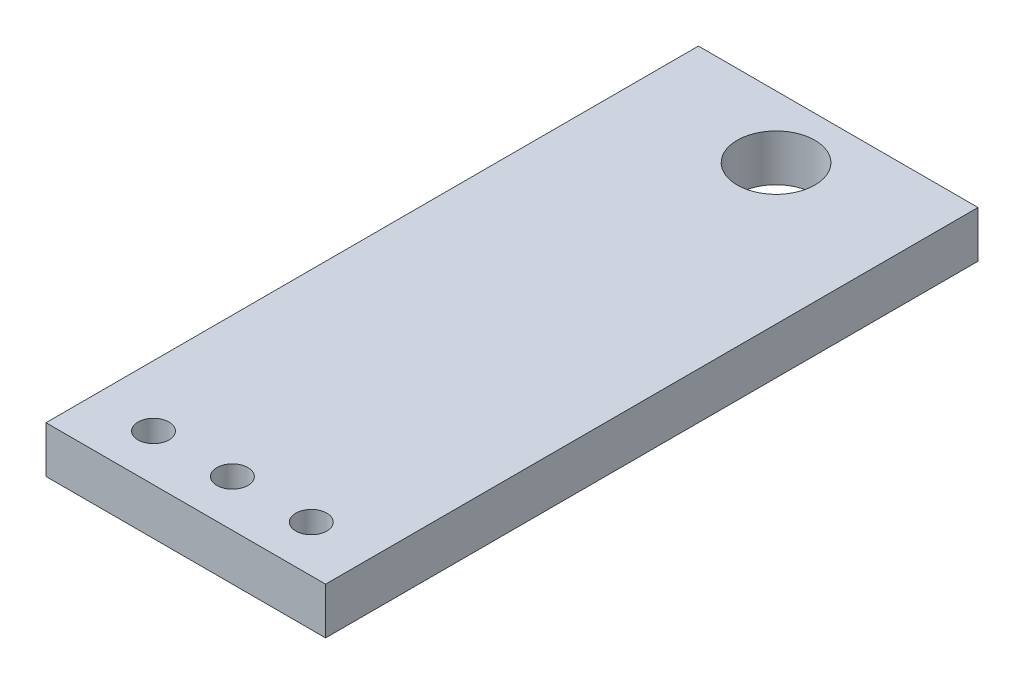
ISO-10303-21;
HEADER;
FILE_DESCRIPTION(('STEP AP214'),'2;1');
FILE_NAME('part.step','',(''),(''),'','','');
FILE_SCHEMA(('AUTOMOTIVE_DESIGN { 1 0 10303 214 1 1 1 1 }'));
ENDSEC;
DATA;
#1=APPLICATION_CONTEXT('core data for automotive mechanical design processes');
#2=APPLICATION_PROTOCOL_DEFINITION('international standard','automotive_design',2000,#1);
#3=PRODUCT_CONTEXT('',#1,'mechanical');
#4=PRODUCT('Part','Part','',(#3));
#5=PRODUCT_RELATED_PRODUCT_CATEGORY('part','',(#4));
#6=PRODUCT_DEFINITION_FORMATION('','',#4);
#7=PRODUCT_DEFINITION_CONTEXT('part definition',#1,'design');
#8=PRODUCT_DEFINITION('design','',#6,#7);
#9=PRODUCT_DEFINITION_SHAPE('','',#8);
#10=(LENGTH_UNIT() NAMED_UNIT(*) SI_UNIT(.MILLI.,.METRE.));
#11=(NAMED_UNIT(*) PLANE_ANGLE_UNIT() SI_UNIT($,.RADIAN.));
#12=(NAMED_UNIT(*) SI_UNIT($,.STERADIAN.) SOLID_ANGLE_UNIT());
#13=UNCERTAINTY_MEASURE_WITH_UNIT(LENGTH_MEASURE(1.E-05),#10,'distance_accuracy_value','');
#14=(GEOMETRIC_REPRESENTATION_CONTEXT(3) GLOBAL_UNCERTAINTY_ASSIGNED_CONTEXT((#13)) GLOBAL_UNIT_ASSIGNED_CONTEXT((#10,
#11,#12)) REPRESENTATION_CONTEXT('',''));
#15=CARTESIAN_POINT('',(0.,0.,0.));
#16=DIRECTION('',(0.,0.,1.));
#17=DIRECTION('',(1.,0.,0.));
#18=AXIS2_PLACEMENT_3D('',#15,#16,#17);
#19=CARTESIAN_POINT('',(0.,1.5,0.));
#20=DIRECTION('',(0.,-1.,0.));
#21=DIRECTION('',(0.,0.,-1.));
#22=AXIS2_PLACEMENT_3D('',#19,#20,#21);
#23=PLANE('',#22);
#24=DIRECTION('',(0.,0.,-1.));
#25=VECTOR('',#24,1.);
#26=CARTESIAN_POINT('',(4.5,1.5,10.5));
#27=LINE('',#26,#25);
#28=CARTESIAN_POINT('',(4.5,1.5,10.5));
#29=VERTEX_POINT('',#28);
#30=CARTESIAN_POINT('',(4.5,1.5,-10.5));
#31=VERTEX_POINT('',#30);
#32=EDGE_CURVE('E84',#29,#31,#27,.T.);
#33=ORIENTED_EDGE('',*,*,#32,.T.);
#34=DIRECTION('',(-1.,0.,0.));
#35=VECTOR('',#34,1.);
#36=CARTESIAN_POINT('',(-4.5,1.5,-10.5));
#37=LINE('',#36,#35);
#38=CARTESIAN_POINT('',(-4.5,1.5,-10.5));
#39=VERTEX_POINT('',#38);
#40=EDGE_CURVE('E79',#31,#39,#37,.T.);
#41=ORIENTED_EDGE('',*,*,#40,.T.);
#42=DIRECTION('',(0.,0.,1.));
#43=VECTOR('',#42,1.);
#44=CARTESIAN_POINT('',(-4.5,1.5,10.5));
#45=LINE('',#44,#43);
#46=CARTESIAN_POINT('',(-4.5,1.5,10.5));
#47=VERTEX_POINT('',#46);
#48=EDGE_CURVE('E82',#39,#47,#45,.T.);
#49=ORIENTED_EDGE('',*,*,#48,.T.);
#50=DIRECTION('',(1.,0.,0.));
#51=VECTOR('',#50,1.);
#52=CARTESIAN_POINT('',(-4.5,1.5,10.5));
#53=LINE('',#52,#51);
#54=EDGE_CURVE('E49',#47,#29,#53,.T.);
#55=ORIENTED_EDGE('',*,*,#54,.T.);
#56=EDGE_LOOP('',(#33,#41,#49,#55));
#57=FACE_BOUND('',#56,.T.);
#58=CARTESIAN_POINT('',(0.,1.5,-8.5));
#59=DIRECTION('',(0.,1.,0.));
#60=DIRECTION('',(0.,0.,1.));
#61=AXIS2_PLACEMENT_3D('',#58,#59,#60);
#62=CIRCLE('',#61,1.25);
#63=CARTESIAN_POINT('',(0.,1.5,-7.25));
#64=VERTEX_POINT('',#63);
#65=EDGE_CURVE('E99',#64,#64,#62,.T.);
#66=ORIENTED_EDGE('',*,*,#65,.F.);
#67=EDGE_LOOP('',(#66));
#68=FACE_BOUND('',#67,.T.);
#69=CARTESIAN_POINT('',(-2.54,1.5,9.));
#70=DIRECTION('',(0.,1.,0.));
#71=DIRECTION('',(0.,0.,1.));
#72=AXIS2_PLACEMENT_3D('',#69,#70,#71);
#73=CIRCLE('',#72,0.5);
#74=CARTESIAN_POINT('',(-2.54,1.5,9.5));
#75=VERTEX_POINT('',#74);
#76=EDGE_CURVE('E114',#75,#75,#73,.T.);
#77=ORIENTED_EDGE('',*,*,#76,.F.);
#78=EDGE_LOOP('',(#77));
#79=FACE_BOUND('',#78,.T.);
#80=CARTESIAN_POINT('',(0.,1.5,9.));
#81=DIRECTION('',(0.,1.,0.));
#82=DIRECTION('',(0.,0.,1.));
#83=AXIS2_PLACEMENT_3D('',#80,#81,#82);
#84=CIRCLE('',#83,0.5);
#85=CARTESIAN_POINT('',(0.,1.5,9.5));
#86=VERTEX_POINT('',#85);
#87=EDGE_CURVE('E120',#86,#86,#84,.T.);
#88=ORIENTED_EDGE('',*,*,#87,.F.);
#89=EDGE_LOOP('',(#88));
#90=FACE_BOUND('',#89,.T.);
#91=CARTESIAN_POINT('',(2.54,1.5,9.));
#92=DIRECTION('',(0.,1.,0.));
#93=DIRECTION('',(0.,0.,1.));
#94=AXIS2_PLACEMENT_3D('',#91,#92,#93);
#95=CIRCLE('',#94,0.5);
#96=CARTESIAN_POINT('',(2.54,1.5,9.5));
#97=VERTEX_POINT('',#96);
#98=EDGE_CURVE('E126',#97,#97,#95,.T.);
#99=ORIENTED_EDGE('',*,*,#98,.F.);
#100=EDGE_LOOP('',(#99));
#101=FACE_BOUND('',#100,.T.);
#102=ADVANCED_FACE('F32',(#57,#68,#79,#90,#101),#23,.F.);
#103=CARTESIAN_POINT('',(0.,0.,0.));
#104=DIRECTION('',(0.,-1.,0.));
#105=DIRECTION('',(0.,0.,-1.));
#106=AXIS2_PLACEMENT_3D('',#103,#104,#105);
#107=PLANE('',#106);
#108=CARTESIAN_POINT('',(0.,0.,9.));
#109=DIRECTION('',(0.,1.,0.));
#110=DIRECTION('',(0.,0.,1.));
#111=AXIS2_PLACEMENT_3D('',#108,#109,#110);
#112=CIRCLE('',#111,0.5);
#113=CARTESIAN_POINT('',(0.,0.,9.5));
#114=VERTEX_POINT('',#113);
#115=EDGE_CURVE('E123',#114,#114,#112,.T.);
#116=ORIENTED_EDGE('',*,*,#115,.T.);
#117=EDGE_LOOP('',(#116));
#118=FACE_BOUND('',#117,.T.);
#119=CARTESIAN_POINT('',(0.,0.,-8.5));
#120=DIRECTION('',(0.,1.,0.));
#121=DIRECTION('',(0.,0.,1.));
#122=AXIS2_PLACEMENT_3D('',#119,#120,#121);
#123=CIRCLE('',#122,1.25);
#124=CARTESIAN_POINT('',(0.,0.,-7.25));
#125=VERTEX_POINT('',#124);
#126=EDGE_CURVE('E111',#125,#125,#123,.T.);
#127=ORIENTED_EDGE('',*,*,#126,.T.);
#128=EDGE_LOOP('',(#127));
#129=FACE_BOUND('',#128,.T.);
#130=DIRECTION('',(0.,0.,-1.));
#131=VECTOR('',#130,1.);
#132=CARTESIAN_POINT('',(4.5,0.,10.5));
#133=LINE('',#132,#131);
#134=CARTESIAN_POINT('',(4.5,0.,10.5));
#135=VERTEX_POINT('',#134);
#136=CARTESIAN_POINT('',(4.5,0.,-10.5));
#137=VERTEX_POINT('',#136);
#138=EDGE_CURVE('E96',#135,#137,#133,.T.);
#139=ORIENTED_EDGE('',*,*,#138,.F.);
#140=DIRECTION('',(1.,0.,0.));
#141=VECTOR('',#140,1.);
#142=CARTESIAN_POINT('',(-4.5,0.,10.5));
#143=LINE('',#142,#141);
#144=CARTESIAN_POINT('',(-4.5,0.,10.5));
#145=VERTEX_POINT('',#144);
#146=EDGE_CURVE('E72',#145,#135,#143,.T.);
#147=ORIENTED_EDGE('',*,*,#146,.F.);
#148=DIRECTION('',(0.,0.,1.));
#149=VECTOR('',#148,1.);
#150=CARTESIAN_POINT('',(-4.5,0.,10.5));
#151=LINE('',#150,#149);
#152=CARTESIAN_POINT('',(-4.5,0.,-10.5));
#153=VERTEX_POINT('',#152);
#154=EDGE_CURVE('E66',#153,#145,#151,.T.);
#155=ORIENTED_EDGE('',*,*,#154,.F.);
#156=DIRECTION('',(-1.,0.,0.));
#157=VECTOR('',#156,1.);
#158=CARTESIAN_POINT('',(-4.5,0.,-10.5));
#159=LINE('',#158,#157);
#160=EDGE_CURVE('E88',#137,#153,#159,.T.);
#161=ORIENTED_EDGE('',*,*,#160,.F.);
#162=EDGE_LOOP('',(#139,#147,#155,#161));
#163=FACE_BOUND('',#162,.T.);
#164=CARTESIAN_POINT('',(-2.54,0.,9.));
#165=DIRECTION('',(0.,1.,0.));
#166=DIRECTION('',(0.,0.,1.));
#167=AXIS2_PLACEMENT_3D('',#164,#165,#166);
#168=CIRCLE('',#167,0.5);
#169=CARTESIAN_POINT('',(-2.54,0.,9.5));
#170=VERTEX_POINT('',#169);
#171=EDGE_CURVE('E117',#170,#170,#168,.T.);
#172=ORIENTED_EDGE('',*,*,#171,.T.);
#173=EDGE_LOOP('',(#172));
#174=FACE_BOUND('',#173,.T.);
#175=CARTESIAN_POINT('',(2.54,0.,9.));
#176=DIRECTION('',(0.,1.,0.));
#177=DIRECTION('',(0.,0.,1.));
#178=AXIS2_PLACEMENT_3D('',#175,#176,#177);
#179=CIRCLE('',#178,0.5);
#180=CARTESIAN_POINT('',(2.54,0.,9.5));
#181=VERTEX_POINT('',#180);
#182=EDGE_CURVE('E129',#181,#181,#179,.T.);
#183=ORIENTED_EDGE('',*,*,#182,.T.);
#184=EDGE_LOOP('',(#183));
#185=FACE_BOUND('',#184,.T.);
#186=ADVANCED_FACE('F107',(#118,#129,#163,#174,#185),#107,.T.);
#187=CARTESIAN_POINT('',(4.5,1.5,10.5));
#188=DIRECTION('',(-1.,0.,0.));
#189=DIRECTION('',(0.,0.,1.));
#190=AXIS2_PLACEMENT_3D('',#187,#188,#189);
#191=PLANE('',#190);
#192=ORIENTED_EDGE('',*,*,#138,.T.);
#193=DIRECTION('',(0.,-1.,0.));
#194=VECTOR('',#193,1.);
#195=CARTESIAN_POINT('',(4.5,1.5,-10.5));
#196=LINE('',#195,#194);
#197=EDGE_CURVE('E11',#31,#137,#196,.T.);
#198=ORIENTED_EDGE('',*,*,#197,.F.);
#199=ORIENTED_EDGE('',*,*,#32,.F.);
#200=DIRECTION('',(0.,-1.,0.));
#201=VECTOR('',#200,1.);
#202=CARTESIAN_POINT('',(4.5,1.5,10.5));
#203=LINE('',#202,#201);
#204=EDGE_CURVE('E92',#29,#135,#203,.T.);
#205=ORIENTED_EDGE('',*,*,#204,.T.);
#206=EDGE_LOOP('',(#192,#198,#199,#205));
#207=FACE_BOUND('',#206,.T.);
#208=ADVANCED_FACE('F34',(#207),#191,.F.);
#209=CARTESIAN_POINT('',(-4.5,1.5,-10.5));
#210=DIRECTION('',(0.,0.,1.));
#211=DIRECTION('',(1.,0.,0.));
#212=AXIS2_PLACEMENT_3D('',#209,#210,#211);
#213=PLANE('',#212);
#214=ORIENTED_EDGE('',*,*,#160,.T.);
#215=DIRECTION('',(0.,-1.,0.));
#216=VECTOR('',#215,1.);
#217=CARTESIAN_POINT('',(-4.5,1.5,-10.5));
#218=LINE('',#217,#216);
#219=EDGE_CURVE('E41',#39,#153,#218,.T.);
#220=ORIENTED_EDGE('',*,*,#219,.F.);
#221=ORIENTED_EDGE('',*,*,#40,.F.);
#222=ORIENTED_EDGE('',*,*,#197,.T.);
#223=EDGE_LOOP('',(#214,#220,#221,#222));
#224=FACE_BOUND('',#223,.T.);
#225=ADVANCED_FACE('F87',(#224),#213,.F.);
#226=CARTESIAN_POINT('',(-4.5,1.5,10.5));
#227=DIRECTION('',(1.,0.,0.));
#228=DIRECTION('',(0.,0.,-1.));
#229=AXIS2_PLACEMENT_3D('',#226,#227,#228);
#230=PLANE('',#229);
#231=ORIENTED_EDGE('',*,*,#154,.T.);
#232=DIRECTION('',(0.,-1.,0.));
#233=VECTOR('',#232,1.);
#234=CARTESIAN_POINT('',(-4.5,1.5,10.5));
#235=LINE('',#234,#233);
#236=EDGE_CURVE('E89',#47,#145,#235,.T.);
#237=ORIENTED_EDGE('',*,*,#236,.F.);
#238=ORIENTED_EDGE('',*,*,#48,.F.);
#239=ORIENTED_EDGE('',*,*,#219,.T.);
#240=EDGE_LOOP('',(#231,#237,#238,#239));
#241=FACE_BOUND('',#240,.T.);
#242=ADVANCED_FACE('F90',(#241),#230,.F.);
#243=CARTESIAN_POINT('',(-4.5,1.5,10.5));
#244=DIRECTION('',(0.,0.,-1.));
#245=DIRECTION('',(-1.,0.,0.));
#246=AXIS2_PLACEMENT_3D('',#243,#244,#245);
#247=PLANE('',#246);
#248=ORIENTED_EDGE('',*,*,#146,.T.);
#249=ORIENTED_EDGE('',*,*,#204,.F.);
#250=ORIENTED_EDGE('',*,*,#54,.F.);
#251=ORIENTED_EDGE('',*,*,#236,.T.);
#252=EDGE_LOOP('',(#248,#249,#250,#251));
#253=FACE_BOUND('',#252,.T.);
#254=ADVANCED_FACE('F104',(#253),#247,.F.);
#255=CARTESIAN_POINT('',(0.,1.5,-8.5));
#256=DIRECTION('',(0.,-1.,0.));
#257=DIRECTION('',(0.,0.,-1.));
#258=AXIS2_PLACEMENT_3D('',#255,#256,#257);
#259=CYLINDRICAL_SURFACE('',#258,1.25);
#260=ORIENTED_EDGE('',*,*,#65,.T.);
#261=EDGE_LOOP('',(#260));
#262=FACE_BOUND('',#261,.T.);
#263=ORIENTED_EDGE('',*,*,#126,.F.);
#264=EDGE_LOOP('',(#263));
#265=FACE_BOUND('',#264,.T.);
#266=ADVANCED_FACE('F146',(#262,#265),#259,.F.);
#267=CARTESIAN_POINT('',(-2.54,1.5,9.));
#268=DIRECTION('',(0.,-1.,0.));
#269=DIRECTION('',(0.,0.,-1.));
#270=AXIS2_PLACEMENT_3D('',#267,#268,#269);
#271=CYLINDRICAL_SURFACE('',#270,0.5);
#272=ORIENTED_EDGE('',*,*,#76,.T.);
#273=EDGE_LOOP('',(#272));
#274=FACE_BOUND('',#273,.T.);
#275=ORIENTED_EDGE('',*,*,#171,.F.);
#276=EDGE_LOOP('',(#275));
#277=FACE_BOUND('',#276,.T.);
#278=ADVANCED_FACE('F192',(#274,#277),#271,.F.);
#279=CARTESIAN_POINT('',(0.,1.5,9.));
#280=DIRECTION('',(0.,-1.,0.));
#281=DIRECTION('',(0.,0.,-1.));
#282=AXIS2_PLACEMENT_3D('',#279,#280,#281);
#283=CYLINDRICAL_SURFACE('',#282,0.5);
#284=ORIENTED_EDGE('',*,*,#87,.T.);
#285=EDGE_LOOP('',(#284));
#286=FACE_BOUND('',#285,.T.);
#287=ORIENTED_EDGE('',*,*,#115,.F.);
#288=EDGE_LOOP('',(#287));
#289=FACE_BOUND('',#288,.T.);
#290=ADVANCED_FACE('F200',(#286,#289),#283,.F.);
#291=CARTESIAN_POINT('',(2.54,1.5,9.));
#292=DIRECTION('',(0.,-1.,0.));
#293=DIRECTION('',(0.,0.,-1.));
#294=AXIS2_PLACEMENT_3D('',#291,#292,#293);
#295=CYLINDRICAL_SURFACE('',#294,0.5);
#296=ORIENTED_EDGE('',*,*,#98,.T.);
#297=EDGE_LOOP('',(#296));
#298=FACE_BOUND('',#297,.T.);
#299=ORIENTED_EDGE('',*,*,#182,.F.);
#300=EDGE_LOOP('',(#299));
#301=FACE_BOUND('',#300,.T.);
#302=ADVANCED_FACE('F135',(#298,#301),#295,.F.);
#303=CLOSED_SHELL('',(#102,#186,#208,#225,#242,#254,#266,#278,#290,#302));
#304=MANIFOLD_SOLID_BREP('B2',#303);
#305=ADVANCED_BREP_SHAPE_REPRESENTATION('',(#18,#304),#14);
#306=SHAPE_DEFINITION_REPRESENTATION(#9,#305);
ENDSEC;
END-ISO-10303-21;
